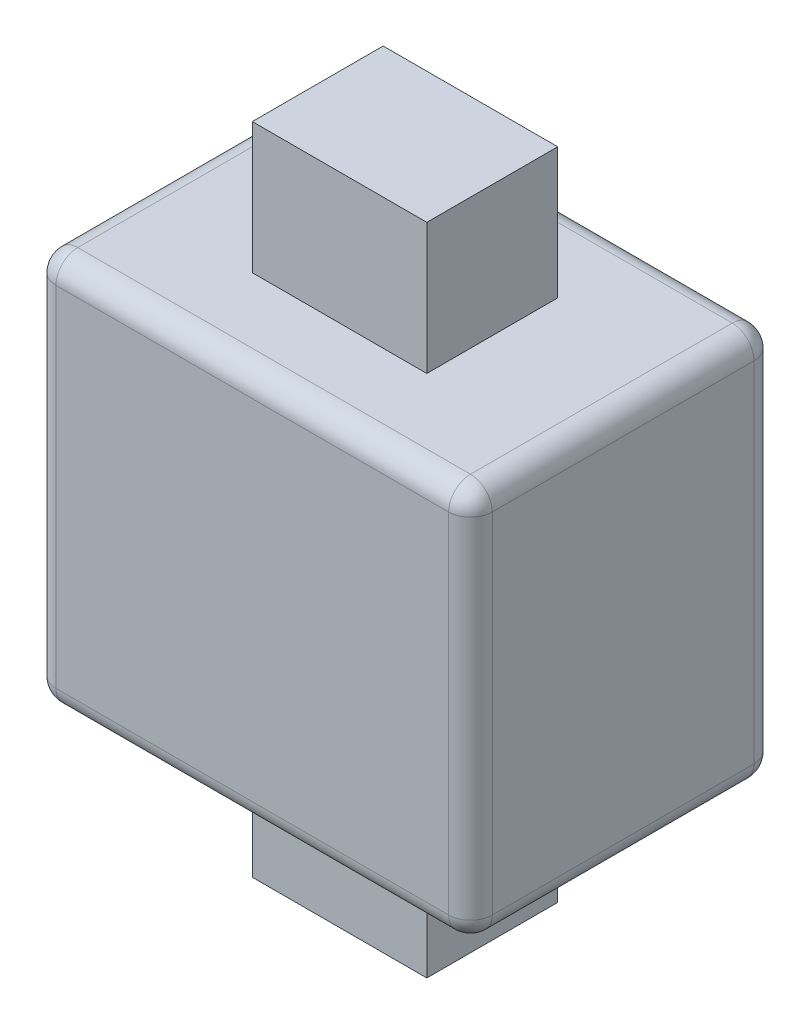
ISO-10303-21;
HEADER;
FILE_DESCRIPTION(('STEP AP214'),'2;1');
FILE_NAME('part.step','',(''),(''),'','','');
FILE_SCHEMA(('AUTOMOTIVE_DESIGN { 1 0 10303 214 1 1 1 1 }'));
ENDSEC;
DATA;
#1=APPLICATION_CONTEXT('core data for automotive mechanical design processes');
#2=APPLICATION_PROTOCOL_DEFINITION('international standard','automotive_design',2000,#1);
#3=PRODUCT_CONTEXT('',#1,'mechanical');
#4=PRODUCT('Part','Part','',(#3));
#5=PRODUCT_RELATED_PRODUCT_CATEGORY('part','',(#4));
#6=PRODUCT_DEFINITION_FORMATION('','',#4);
#7=PRODUCT_DEFINITION_CONTEXT('part definition',#1,'design');
#8=PRODUCT_DEFINITION('design','',#6,#7);
#9=PRODUCT_DEFINITION_SHAPE('','',#8);
#10=(LENGTH_UNIT() NAMED_UNIT(*) SI_UNIT(.MILLI.,.METRE.));
#11=(NAMED_UNIT(*) PLANE_ANGLE_UNIT() SI_UNIT($,.RADIAN.));
#12=(NAMED_UNIT(*) SI_UNIT($,.STERADIAN.) SOLID_ANGLE_UNIT());
#13=UNCERTAINTY_MEASURE_WITH_UNIT(LENGTH_MEASURE(1.E-05),#10,'distance_accuracy_value','');
#14=(GEOMETRIC_REPRESENTATION_CONTEXT(3) GLOBAL_UNCERTAINTY_ASSIGNED_CONTEXT((#13)) GLOBAL_UNIT_ASSIGNED_CONTEXT((#10,
#11,#12)) REPRESENTATION_CONTEXT('',''));
#15=CARTESIAN_POINT('',(0.,0.,0.));
#16=DIRECTION('',(0.,0.,1.));
#17=DIRECTION('',(1.,0.,0.));
#18=AXIS2_PLACEMENT_3D('',#15,#16,#17);
#19=CARTESIAN_POINT('',(2.5,2.25,3.5));
#20=DIRECTION('',(-1.,0.,0.));
#21=DIRECTION('',(0.,0.,1.));
#22=AXIS2_PLACEMENT_3D('',#19,#20,#21);
#23=PLANE('',#22);
#24=DIRECTION('',(0.,1.,0.));
#25=VECTOR('',#24,1.);
#26=CARTESIAN_POINT('',(2.5,-2.25,3.25));
#27=LINE('',#26,#25);
#28=CARTESIAN_POINT('',(2.5,2.,3.25));
#29=VERTEX_POINT('',#28);
#30=CARTESIAN_POINT('',(2.5,-2.,3.25));
#31=VERTEX_POINT('',#30);
#32=EDGE_CURVE('E280',#29,#31,#27,.F.);
#33=ORIENTED_EDGE('',*,*,#32,.T.);
#34=DIRECTION('',(0.,0.,-1.));
#35=VECTOR('',#34,1.);
#36=CARTESIAN_POINT('',(2.5,-2.,3.5));
#37=LINE('',#36,#35);
#38=CARTESIAN_POINT('',(2.5,-2.,0.25));
#39=VERTEX_POINT('',#38);
#40=EDGE_CURVE('E284',#31,#39,#37,.T.);
#41=ORIENTED_EDGE('',*,*,#40,.T.);
#42=DIRECTION('',(0.,1.,0.));
#43=VECTOR('',#42,1.);
#44=CARTESIAN_POINT('',(2.5,2.25,0.25));
#45=LINE('',#44,#43);
#46=CARTESIAN_POINT('',(2.5,2.,0.25));
#47=VERTEX_POINT('',#46);
#48=EDGE_CURVE('E282',#39,#47,#45,.T.);
#49=ORIENTED_EDGE('',*,*,#48,.T.);
#50=DIRECTION('',(0.,0.,-1.));
#51=VECTOR('',#50,1.);
#52=CARTESIAN_POINT('',(2.5,2.,3.5));
#53=LINE('',#52,#51);
#54=EDGE_CURVE('E278',#47,#29,#53,.F.);
#55=ORIENTED_EDGE('',*,*,#54,.T.);
#56=EDGE_LOOP('',(#33,#41,#49,#55));
#57=FACE_BOUND('',#56,.T.);
#58=ADVANCED_FACE('F38',(#57),#23,.F.);
#59=CARTESIAN_POINT('',(-2.5,2.25,3.5));
#60=DIRECTION('',(0.,-1.,0.));
#61=DIRECTION('',(0.,0.,-1.));
#62=AXIS2_PLACEMENT_3D('',#59,#60,#61);
#63=PLANE('',#62);
#64=DIRECTION('',(0.,0.,-1.));
#65=VECTOR('',#64,1.);
#66=CARTESIAN_POINT('',(2.25,2.25,3.5));
#67=LINE('',#66,#65);
#68=CARTESIAN_POINT('',(2.25,2.25,3.25));
#69=VERTEX_POINT('',#68);
#70=CARTESIAN_POINT('',(2.25,2.25,0.25));
#71=VERTEX_POINT('',#70);
#72=EDGE_CURVE('E62',#69,#71,#67,.T.);
#73=ORIENTED_EDGE('',*,*,#72,.T.);
#74=DIRECTION('',(-1.,0.,0.));
#75=VECTOR('',#74,1.);
#76=CARTESIAN_POINT('',(-2.5,2.25,0.25));
#77=LINE('',#76,#75);
#78=CARTESIAN_POINT('',(-2.25,2.25,0.25));
#79=VERTEX_POINT('',#78);
#80=EDGE_CURVE('E11',#71,#79,#77,.T.);
#81=ORIENTED_EDGE('',*,*,#80,.T.);
#82=DIRECTION('',(0.,0.,-1.));
#83=VECTOR('',#82,1.);
#84=CARTESIAN_POINT('',(-2.25,2.25,3.5));
#85=LINE('',#84,#83);
#86=CARTESIAN_POINT('',(-2.25,2.25,3.25));
#87=VERTEX_POINT('',#86);
#88=EDGE_CURVE('E47',#79,#87,#85,.F.);
#89=ORIENTED_EDGE('',*,*,#88,.T.);
#90=DIRECTION('',(-1.,0.,0.));
#91=VECTOR('',#90,1.);
#92=CARTESIAN_POINT('',(2.5,2.25,3.25));
#93=LINE('',#92,#91);
#94=EDGE_CURVE('E296',#87,#69,#93,.F.);
#95=ORIENTED_EDGE('',*,*,#94,.T.);
#96=EDGE_LOOP('',(#73,#81,#89,#95));
#97=FACE_BOUND('',#96,.T.);
#98=DIRECTION('',(-1.,0.,0.));
#99=VECTOR('',#98,1.);
#100=CARTESIAN_POINT('',(0.,2.25,2.5));
#101=LINE('',#100,#99);
#102=CARTESIAN_POINT('',(1.,2.25,2.5));
#103=VERTEX_POINT('',#102);
#104=CARTESIAN_POINT('',(-1.,2.25,2.5));
#105=VERTEX_POINT('',#104);
#106=EDGE_CURVE('E235',#103,#105,#101,.T.);
#107=ORIENTED_EDGE('',*,*,#106,.T.);
#108=DIRECTION('',(0.,0.,-1.));
#109=VECTOR('',#108,1.);
#110=CARTESIAN_POINT('',(-0.999999999999999,2.25,0.));
#111=LINE('',#110,#109);
#112=CARTESIAN_POINT('',(-1.,2.25,1.));
#113=VERTEX_POINT('',#112);
#114=EDGE_CURVE('E189',#105,#113,#111,.T.);
#115=ORIENTED_EDGE('',*,*,#114,.T.);
#116=DIRECTION('',(-1.,0.,0.));
#117=VECTOR('',#116,1.);
#118=CARTESIAN_POINT('',(0.,2.25,1.));
#119=LINE('',#118,#117);
#120=CARTESIAN_POINT('',(1.,2.25,1.));
#121=VERTEX_POINT('',#120);
#122=EDGE_CURVE('E225',#121,#113,#119,.T.);
#123=ORIENTED_EDGE('',*,*,#122,.F.);
#124=DIRECTION('',(0.,0.,-1.));
#125=VECTOR('',#124,1.);
#126=CARTESIAN_POINT('',(1.,2.25,0.));
#127=LINE('',#126,#125);
#128=EDGE_CURVE('E238',#103,#121,#127,.T.);
#129=ORIENTED_EDGE('',*,*,#128,.F.);
#130=EDGE_LOOP('',(#107,#115,#123,#129));
#131=FACE_BOUND('',#130,.T.);
#132=ADVANCED_FACE('F407',(#97,#131),#63,.F.);
#133=CARTESIAN_POINT('',(-2.5,2.25,3.5));
#134=DIRECTION('',(1.,0.,0.));
#135=DIRECTION('',(0.,1.,0.));
#136=AXIS2_PLACEMENT_3D('',#133,#134,#135);
#137=PLANE('',#136);
#138=DIRECTION('',(0.,-1.,0.));
#139=VECTOR('',#138,1.);
#140=CARTESIAN_POINT('',(-2.5,2.25,0.25));
#141=LINE('',#140,#139);
#142=CARTESIAN_POINT('',(-2.5,2.,0.25));
#143=VERTEX_POINT('',#142);
#144=CARTESIAN_POINT('',(-2.5,-2.,0.25));
#145=VERTEX_POINT('',#144);
#146=EDGE_CURVE('E264',#143,#145,#141,.T.);
#147=ORIENTED_EDGE('',*,*,#146,.T.);
#148=DIRECTION('',(0.,0.,-1.));
#149=VECTOR('',#148,1.);
#150=CARTESIAN_POINT('',(-2.5,-2.,3.5));
#151=LINE('',#150,#149);
#152=CARTESIAN_POINT('',(-2.5,-2.,3.25));
#153=VERTEX_POINT('',#152);
#154=EDGE_CURVE('E266',#145,#153,#151,.F.);
#155=ORIENTED_EDGE('',*,*,#154,.T.);
#156=DIRECTION('',(0.,-1.,0.));
#157=VECTOR('',#156,1.);
#158=CARTESIAN_POINT('',(-2.5,2.25,3.25));
#159=LINE('',#158,#157);
#160=CARTESIAN_POINT('',(-2.5,2.,3.25));
#161=VERTEX_POINT('',#160);
#162=EDGE_CURVE('E262',#153,#161,#159,.F.);
#163=ORIENTED_EDGE('',*,*,#162,.T.);
#164=DIRECTION('',(0.,0.,-1.));
#165=VECTOR('',#164,1.);
#166=CARTESIAN_POINT('',(-2.5,2.,3.5));
#167=LINE('',#166,#165);
#168=EDGE_CURVE('E260',#161,#143,#167,.T.);
#169=ORIENTED_EDGE('',*,*,#168,.T.);
#170=EDGE_LOOP('',(#147,#155,#163,#169));
#171=FACE_BOUND('',#170,.T.);
#172=ADVANCED_FACE('F443',(#171),#137,.F.);
#173=CARTESIAN_POINT('',(-2.5,-2.25,3.5));
#174=DIRECTION('',(0.,1.,0.));
#175=DIRECTION('',(0.,0.,1.));
#176=AXIS2_PLACEMENT_3D('',#173,#174,#175);
#177=PLANE('',#176);
#178=DIRECTION('',(1.,0.,0.));
#179=VECTOR('',#178,1.);
#180=CARTESIAN_POINT('',(-2.5,-2.25,3.25));
#181=LINE('',#180,#179);
#182=CARTESIAN_POINT('',(2.25,-2.25,3.25));
#183=VERTEX_POINT('',#182);
#184=CARTESIAN_POINT('',(-2.25,-2.25,3.25));
#185=VERTEX_POINT('',#184);
#186=EDGE_CURVE('E255',#183,#185,#181,.F.);
#187=ORIENTED_EDGE('',*,*,#186,.T.);
#188=DIRECTION('',(0.,0.,-1.));
#189=VECTOR('',#188,1.);
#190=CARTESIAN_POINT('',(-2.25,-2.25,3.5));
#191=LINE('',#190,#189);
#192=CARTESIAN_POINT('',(-2.25,-2.25,0.25));
#193=VERTEX_POINT('',#192);
#194=EDGE_CURVE('E257',#185,#193,#191,.T.);
#195=ORIENTED_EDGE('',*,*,#194,.T.);
#196=DIRECTION('',(1.,0.,0.));
#197=VECTOR('',#196,1.);
#198=CARTESIAN_POINT('',(-2.5,-2.25,0.25));
#199=LINE('',#198,#197);
#200=CARTESIAN_POINT('',(2.25,-2.25,0.25));
#201=VERTEX_POINT('',#200);
#202=EDGE_CURVE('E251',#193,#201,#199,.T.);
#203=ORIENTED_EDGE('',*,*,#202,.T.);
#204=DIRECTION('',(0.,0.,-1.));
#205=VECTOR('',#204,1.);
#206=CARTESIAN_POINT('',(2.25,-2.25,3.5));
#207=LINE('',#206,#205);
#208=EDGE_CURVE('E253',#201,#183,#207,.F.);
#209=ORIENTED_EDGE('',*,*,#208,.T.);
#210=EDGE_LOOP('',(#187,#195,#203,#209));
#211=FACE_BOUND('',#210,.T.);
#212=DIRECTION('',(1.,0.,0.));
#213=VECTOR('',#212,1.);
#214=CARTESIAN_POINT('',(0.,-2.25,2.5));
#215=LINE('',#214,#213);
#216=CARTESIAN_POINT('',(-1.,-2.25,2.5));
#217=VERTEX_POINT('',#216);
#218=CARTESIAN_POINT('',(1.,-2.25,2.5));
#219=VERTEX_POINT('',#218);
#220=EDGE_CURVE('E210',#217,#219,#215,.T.);
#221=ORIENTED_EDGE('',*,*,#220,.T.);
#222=DIRECTION('',(0.,0.,-1.));
#223=VECTOR('',#222,1.);
#224=CARTESIAN_POINT('',(1.,-2.25,0.));
#225=LINE('',#224,#223);
#226=CARTESIAN_POINT('',(1.,-2.25,1.));
#227=VERTEX_POINT('',#226);
#228=EDGE_CURVE('E184',#219,#227,#225,.T.);
#229=ORIENTED_EDGE('',*,*,#228,.T.);
#230=DIRECTION('',(1.,0.,0.));
#231=VECTOR('',#230,1.);
#232=CARTESIAN_POINT('',(0.,-2.25,1.));
#233=LINE('',#232,#231);
#234=CARTESIAN_POINT('',(-1.,-2.25,0.999999999999999));
#235=VERTEX_POINT('',#234);
#236=EDGE_CURVE('E199',#235,#227,#233,.T.);
#237=ORIENTED_EDGE('',*,*,#236,.F.);
#238=DIRECTION('',(0.,0.,-1.));
#239=VECTOR('',#238,1.);
#240=CARTESIAN_POINT('',(-1.,-2.25,0.));
#241=LINE('',#240,#239);
#242=EDGE_CURVE('E212',#217,#235,#241,.T.);
#243=ORIENTED_EDGE('',*,*,#242,.F.);
#244=EDGE_LOOP('',(#221,#229,#237,#243));
#245=FACE_BOUND('',#244,.T.);
#246=ADVANCED_FACE('F660',(#211,#245),#177,.F.);
#247=CARTESIAN_POINT('',(0.,0.,3.5));
#248=DIRECTION('',(0.,0.,1.));
#249=DIRECTION('',(1.,0.,0.));
#250=AXIS2_PLACEMENT_3D('',#247,#248,#249);
#251=PLANE('',#250);
#252=DIRECTION('',(0.,-1.,0.));
#253=VECTOR('',#252,1.);
#254=CARTESIAN_POINT('',(-2.25,-2.25,3.5));
#255=LINE('',#254,#253);
#256=CARTESIAN_POINT('',(-2.25,2.,3.5));
#257=VERTEX_POINT('',#256);
#258=CARTESIAN_POINT('',(-2.25,-2.,3.5));
#259=VERTEX_POINT('',#258);
#260=EDGE_CURVE('E271',#257,#259,#255,.T.);
#261=ORIENTED_EDGE('',*,*,#260,.T.);
#262=DIRECTION('',(1.,0.,0.));
#263=VECTOR('',#262,1.);
#264=CARTESIAN_POINT('',(2.5,-2.,3.5));
#265=LINE('',#264,#263);
#266=CARTESIAN_POINT('',(2.25,-2.,3.5));
#267=VERTEX_POINT('',#266);
#268=EDGE_CURVE('E275',#259,#267,#265,.T.);
#269=ORIENTED_EDGE('',*,*,#268,.T.);
#270=DIRECTION('',(0.,1.,0.));
#271=VECTOR('',#270,1.);
#272=CARTESIAN_POINT('',(2.25,2.25,3.5));
#273=LINE('',#272,#271);
#274=CARTESIAN_POINT('',(2.25,2.,3.5));
#275=VERTEX_POINT('',#274);
#276=EDGE_CURVE('E273',#267,#275,#273,.T.);
#277=ORIENTED_EDGE('',*,*,#276,.T.);
#278=DIRECTION('',(-1.,0.,0.));
#279=VECTOR('',#278,1.);
#280=CARTESIAN_POINT('',(-2.5,2.,3.5));
#281=LINE('',#280,#279);
#282=EDGE_CURVE('E269',#275,#257,#281,.T.);
#283=ORIENTED_EDGE('',*,*,#282,.T.);
#284=EDGE_LOOP('',(#261,#269,#277,#283));
#285=FACE_BOUND('',#284,.T.);
#286=ADVANCED_FACE('F379',(#285),#251,.T.);
#287=CARTESIAN_POINT('',(0.,0.,0.));
#288=DIRECTION('',(0.,0.,1.));
#289=DIRECTION('',(1.,0.,0.));
#290=AXIS2_PLACEMENT_3D('',#287,#288,#289);
#291=PLANE('',#290);
#292=DIRECTION('',(0.,1.,0.));
#293=VECTOR('',#292,1.);
#294=CARTESIAN_POINT('',(2.25,0.,0.));
#295=LINE('',#294,#293);
#296=CARTESIAN_POINT('',(2.25,2.,0.));
#297=VERTEX_POINT('',#296);
#298=CARTESIAN_POINT('',(2.25,-2.,0.));
#299=VERTEX_POINT('',#298);
#300=EDGE_CURVE('E291',#297,#299,#295,.F.);
#301=ORIENTED_EDGE('',*,*,#300,.T.);
#302=DIRECTION('',(1.,0.,0.));
#303=VECTOR('',#302,1.);
#304=CARTESIAN_POINT('',(0.,-2.,0.));
#305=LINE('',#304,#303);
#306=CARTESIAN_POINT('',(-2.25,-2.,0.));
#307=VERTEX_POINT('',#306);
#308=EDGE_CURVE('E293',#299,#307,#305,.F.);
#309=ORIENTED_EDGE('',*,*,#308,.T.);
#310=DIRECTION('',(0.,-1.,0.));
#311=VECTOR('',#310,1.);
#312=CARTESIAN_POINT('',(-2.25,0.,0.));
#313=LINE('',#312,#311);
#314=CARTESIAN_POINT('',(-2.25,2.,0.));
#315=VERTEX_POINT('',#314);
#316=EDGE_CURVE('E289',#307,#315,#313,.F.);
#317=ORIENTED_EDGE('',*,*,#316,.T.);
#318=DIRECTION('',(-1.,0.,0.));
#319=VECTOR('',#318,1.);
#320=CARTESIAN_POINT('',(0.,2.,0.));
#321=LINE('',#320,#319);
#322=EDGE_CURVE('E287',#315,#297,#321,.F.);
#323=ORIENTED_EDGE('',*,*,#322,.T.);
#324=EDGE_LOOP('',(#301,#309,#317,#323));
#325=FACE_BOUND('',#324,.T.);
#326=ADVANCED_FACE('F677',(#325),#291,.F.);
#327=CARTESIAN_POINT('',(-0.999999999999999,3.75,0.));
#328=DIRECTION('',(-1.,0.,0.));
#329=DIRECTION('',(0.,0.,1.));
#330=AXIS2_PLACEMENT_3D('',#327,#328,#329);
#331=PLANE('',#330);
#332=ORIENTED_EDGE('',*,*,#114,.F.);
#333=DIRECTION('',(0.,-1.,0.));
#334=VECTOR('',#333,1.);
#335=CARTESIAN_POINT('',(-1.,3.75,2.5));
#336=LINE('',#335,#334);
#337=CARTESIAN_POINT('',(-1.,3.75,2.5));
#338=VERTEX_POINT('',#337);
#339=EDGE_CURVE('E248',#338,#105,#336,.T.);
#340=ORIENTED_EDGE('',*,*,#339,.F.);
#341=DIRECTION('',(0.,0.,-1.));
#342=VECTOR('',#341,1.);
#343=CARTESIAN_POINT('',(-0.999999999999999,3.75,0.));
#344=LINE('',#343,#342);
#345=CARTESIAN_POINT('',(-1.,3.75,1.));
#346=VERTEX_POINT('',#345);
#347=EDGE_CURVE('E221',#338,#346,#344,.T.);
#348=ORIENTED_EDGE('',*,*,#347,.T.);
#349=DIRECTION('',(0.,-1.,0.));
#350=VECTOR('',#349,1.);
#351=CARTESIAN_POINT('',(-1.,3.75,1.));
#352=LINE('',#351,#350);
#353=EDGE_CURVE('E232',#346,#113,#352,.T.);
#354=ORIENTED_EDGE('',*,*,#353,.T.);
#355=EDGE_LOOP('',(#332,#340,#348,#354));
#356=FACE_BOUND('',#355,.T.);
#357=ADVANCED_FACE('F685',(#356),#331,.T.);
#358=CARTESIAN_POINT('',(0.,3.75,2.5));
#359=DIRECTION('',(0.,0.,1.));
#360=DIRECTION('',(1.,0.,0.));
#361=AXIS2_PLACEMENT_3D('',#358,#359,#360);
#362=PLANE('',#361);
#363=ORIENTED_EDGE('',*,*,#106,.F.);
#364=DIRECTION('',(0.,-1.,0.));
#365=VECTOR('',#364,1.);
#366=CARTESIAN_POINT('',(1.,3.75,2.5));
#367=LINE('',#366,#365);
#368=CARTESIAN_POINT('',(1.,3.75,2.5));
#369=VERTEX_POINT('',#368);
#370=EDGE_CURVE('E246',#369,#103,#367,.T.);
#371=ORIENTED_EDGE('',*,*,#370,.F.);
#372=DIRECTION('',(-1.,0.,0.));
#373=VECTOR('',#372,1.);
#374=CARTESIAN_POINT('',(0.,3.75,2.5));
#375=LINE('',#374,#373);
#376=EDGE_CURVE('E224',#369,#338,#375,.T.);
#377=ORIENTED_EDGE('',*,*,#376,.T.);
#378=ORIENTED_EDGE('',*,*,#339,.T.);
#379=EDGE_LOOP('',(#363,#371,#377,#378));
#380=FACE_BOUND('',#379,.T.);
#381=ADVANCED_FACE('F698',(#380),#362,.T.);
#382=CARTESIAN_POINT('',(1.,3.75,0.));
#383=DIRECTION('',(-1.,0.,0.));
#384=DIRECTION('',(0.,0.,1.));
#385=AXIS2_PLACEMENT_3D('',#382,#383,#384);
#386=PLANE('',#385);
#387=ORIENTED_EDGE('',*,*,#128,.T.);
#388=DIRECTION('',(0.,-1.,0.));
#389=VECTOR('',#388,1.);
#390=CARTESIAN_POINT('',(1.,3.75,1.));
#391=LINE('',#390,#389);
#392=CARTESIAN_POINT('',(1.,3.75,1.));
#393=VERTEX_POINT('',#392);
#394=EDGE_CURVE('E243',#393,#121,#391,.T.);
#395=ORIENTED_EDGE('',*,*,#394,.F.);
#396=DIRECTION('',(0.,0.,-1.));
#397=VECTOR('',#396,1.);
#398=CARTESIAN_POINT('',(1.,3.75,0.));
#399=LINE('',#398,#397);
#400=EDGE_CURVE('E228',#369,#393,#399,.T.);
#401=ORIENTED_EDGE('',*,*,#400,.F.);
#402=ORIENTED_EDGE('',*,*,#370,.T.);
#403=EDGE_LOOP('',(#387,#395,#401,#402));
#404=FACE_BOUND('',#403,.T.);
#405=ADVANCED_FACE('F707',(#404),#386,.F.);
#406=CARTESIAN_POINT('',(0.,3.75,1.));
#407=DIRECTION('',(0.,0.,1.));
#408=DIRECTION('',(1.,0.,0.));
#409=AXIS2_PLACEMENT_3D('',#406,#407,#408);
#410=PLANE('',#409);
#411=ORIENTED_EDGE('',*,*,#122,.T.);
#412=ORIENTED_EDGE('',*,*,#353,.F.);
#413=DIRECTION('',(-1.,0.,0.));
#414=VECTOR('',#413,1.);
#415=CARTESIAN_POINT('',(0.,3.75,1.));
#416=LINE('',#415,#414);
#417=EDGE_CURVE('E230',#393,#346,#416,.T.);
#418=ORIENTED_EDGE('',*,*,#417,.F.);
#419=ORIENTED_EDGE('',*,*,#394,.T.);
#420=EDGE_LOOP('',(#411,#412,#418,#419));
#421=FACE_BOUND('',#420,.T.);
#422=ADVANCED_FACE('F714',(#421),#410,.F.);
#423=CARTESIAN_POINT('',(0.,3.75,0.));
#424=DIRECTION('',(0.,1.,0.));
#425=DIRECTION('',(0.,0.,1.));
#426=AXIS2_PLACEMENT_3D('',#423,#424,#425);
#427=PLANE('',#426);
#428=ORIENTED_EDGE('',*,*,#347,.F.);
#429=ORIENTED_EDGE('',*,*,#376,.F.);
#430=ORIENTED_EDGE('',*,*,#400,.T.);
#431=ORIENTED_EDGE('',*,*,#417,.T.);
#432=EDGE_LOOP('',(#428,#429,#430,#431));
#433=FACE_BOUND('',#432,.T.);
#434=ADVANCED_FACE('F722',(#433),#427,.T.);
#435=CARTESIAN_POINT('',(1.,-3.75,0.));
#436=DIRECTION('',(1.,0.,0.));
#437=DIRECTION('',(0.,0.,-1.));
#438=AXIS2_PLACEMENT_3D('',#435,#436,#437);
#439=PLANE('',#438);
#440=ORIENTED_EDGE('',*,*,#228,.F.);
#441=DIRECTION('',(0.,1.,0.));
#442=VECTOR('',#441,1.);
#443=CARTESIAN_POINT('',(1.,-3.75,2.5));
#444=LINE('',#443,#442);
#445=CARTESIAN_POINT('',(1.,-3.75,2.5));
#446=VERTEX_POINT('',#445);
#447=EDGE_CURVE('E179',#446,#219,#444,.T.);
#448=ORIENTED_EDGE('',*,*,#447,.F.);
#449=DIRECTION('',(0.,0.,-1.));
#450=VECTOR('',#449,1.);
#451=CARTESIAN_POINT('',(1.,-3.75,0.));
#452=LINE('',#451,#450);
#453=CARTESIAN_POINT('',(1.,-3.75,1.));
#454=VERTEX_POINT('',#453);
#455=EDGE_CURVE('E182',#446,#454,#452,.T.);
#456=ORIENTED_EDGE('',*,*,#455,.T.);
#457=DIRECTION('',(0.,1.,0.));
#458=VECTOR('',#457,1.);
#459=CARTESIAN_POINT('',(1.,-3.75,1.));
#460=LINE('',#459,#458);
#461=EDGE_CURVE('E208',#454,#227,#460,.T.);
#462=ORIENTED_EDGE('',*,*,#461,.T.);
#463=EDGE_LOOP('',(#440,#448,#456,#462));
#464=FACE_BOUND('',#463,.T.);
#465=ADVANCED_FACE('F181',(#464),#439,.T.);
#466=CARTESIAN_POINT('',(0.,-3.75,2.5));
#467=DIRECTION('',(0.,0.,1.));
#468=DIRECTION('',(1.,0.,0.));
#469=AXIS2_PLACEMENT_3D('',#466,#467,#468);
#470=PLANE('',#469);
#471=ORIENTED_EDGE('',*,*,#220,.F.);
#472=DIRECTION('',(0.,1.,0.));
#473=VECTOR('',#472,1.);
#474=CARTESIAN_POINT('',(-1.,-3.75,2.5));
#475=LINE('',#474,#473);
#476=CARTESIAN_POINT('',(-1.,-3.75,2.5));
#477=VERTEX_POINT('',#476);
#478=EDGE_CURVE('E190',#477,#217,#475,.T.);
#479=ORIENTED_EDGE('',*,*,#478,.F.);
#480=DIRECTION('',(1.,0.,0.));
#481=VECTOR('',#480,1.);
#482=CARTESIAN_POINT('',(0.,-3.75,2.5));
#483=LINE('',#482,#481);
#484=EDGE_CURVE('E195',#477,#446,#483,.T.);
#485=ORIENTED_EDGE('',*,*,#484,.T.);
#486=ORIENTED_EDGE('',*,*,#447,.T.);
#487=EDGE_LOOP('',(#471,#479,#485,#486));
#488=FACE_BOUND('',#487,.T.);
#489=ADVANCED_FACE('F201',(#488),#470,.T.);
#490=CARTESIAN_POINT('',(-1.,-3.75,0.));
#491=DIRECTION('',(1.,0.,0.));
#492=DIRECTION('',(0.,0.,-1.));
#493=AXIS2_PLACEMENT_3D('',#490,#491,#492);
#494=PLANE('',#493);
#495=ORIENTED_EDGE('',*,*,#242,.T.);
#496=DIRECTION('',(0.,1.,0.));
#497=VECTOR('',#496,1.);
#498=CARTESIAN_POINT('',(-1.,-3.75,0.999999999999999));
#499=LINE('',#498,#497);
#500=CARTESIAN_POINT('',(-1.,-3.75,0.999999999999999));
#501=VERTEX_POINT('',#500);
#502=EDGE_CURVE('E217',#501,#235,#499,.T.);
#503=ORIENTED_EDGE('',*,*,#502,.F.);
#504=DIRECTION('',(0.,0.,-1.));
#505=VECTOR('',#504,1.);
#506=CARTESIAN_POINT('',(-1.,-3.75,0.));
#507=LINE('',#506,#505);
#508=EDGE_CURVE('E203',#477,#501,#507,.T.);
#509=ORIENTED_EDGE('',*,*,#508,.F.);
#510=ORIENTED_EDGE('',*,*,#478,.T.);
#511=EDGE_LOOP('',(#495,#503,#509,#510));
#512=FACE_BOUND('',#511,.T.);
#513=ADVANCED_FACE('F741',(#512),#494,.F.);
#514=CARTESIAN_POINT('',(0.,-3.75,1.));
#515=DIRECTION('',(0.,0.,1.));
#516=DIRECTION('',(1.,0.,0.));
#517=AXIS2_PLACEMENT_3D('',#514,#515,#516);
#518=PLANE('',#517);
#519=ORIENTED_EDGE('',*,*,#236,.T.);
#520=ORIENTED_EDGE('',*,*,#461,.F.);
#521=DIRECTION('',(1.,0.,0.));
#522=VECTOR('',#521,1.);
#523=CARTESIAN_POINT('',(0.,-3.75,1.));
#524=LINE('',#523,#522);
#525=EDGE_CURVE('E197',#501,#454,#524,.T.);
#526=ORIENTED_EDGE('',*,*,#525,.F.);
#527=ORIENTED_EDGE('',*,*,#502,.T.);
#528=EDGE_LOOP('',(#519,#520,#526,#527));
#529=FACE_BOUND('',#528,.T.);
#530=ADVANCED_FACE('F630',(#529),#518,.F.);
#531=CARTESIAN_POINT('',(0.,-3.75,0.));
#532=DIRECTION('',(0.,-1.,0.));
#533=DIRECTION('',(0.,0.,-1.));
#534=AXIS2_PLACEMENT_3D('',#531,#532,#533);
#535=PLANE('',#534);
#536=ORIENTED_EDGE('',*,*,#455,.F.);
#537=ORIENTED_EDGE('',*,*,#484,.F.);
#538=ORIENTED_EDGE('',*,*,#508,.T.);
#539=ORIENTED_EDGE('',*,*,#525,.T.);
#540=EDGE_LOOP('',(#536,#537,#538,#539));
#541=FACE_BOUND('',#540,.T.);
#542=ADVANCED_FACE('F194',(#541),#535,.T.);
#543=CARTESIAN_POINT('',(2.25,2.,3.5));
#544=DIRECTION('',(0.,0.,-1.));
#545=DIRECTION('',(-1.,0.,0.));
#546=AXIS2_PLACEMENT_3D('',#543,#544,#545);
#547=CYLINDRICAL_SURFACE('',#546,0.25);
#548=CARTESIAN_POINT('',(2.25,2.,3.25));
#549=DIRECTION('',(0.,0.,1.));
#550=DIRECTION('',(1.,0.,0.));
#551=AXIS2_PLACEMENT_3D('',#548,#549,#550);
#552=CIRCLE('',#551,0.25);
#553=EDGE_CURVE('E42',#29,#69,#552,.T.);
#554=ORIENTED_EDGE('',*,*,#553,.F.);
#555=ORIENTED_EDGE('',*,*,#54,.F.);
#556=CARTESIAN_POINT('',(2.25,2.,0.25));
#557=DIRECTION('',(0.,0.,-1.));
#558=DIRECTION('',(-1.,0.,0.));
#559=AXIS2_PLACEMENT_3D('',#556,#557,#558);
#560=CIRCLE('',#559,0.25);
#561=EDGE_CURVE('E357',#71,#47,#560,.T.);
#562=ORIENTED_EDGE('',*,*,#561,.F.);
#563=ORIENTED_EDGE('',*,*,#72,.F.);
#564=EDGE_LOOP('',(#554,#555,#562,#563));
#565=FACE_BOUND('',#564,.T.);
#566=ADVANCED_FACE('F40',(#565),#547,.T.);
#567=CARTESIAN_POINT('',(2.25,2.,3.25));
#568=DIRECTION('',(0.,0.,1.));
#569=DIRECTION('',(1.,0.,0.));
#570=AXIS2_PLACEMENT_3D('',#567,#568,#569);
#571=SPHERICAL_SURFACE('',#570,0.25);
#572=CARTESIAN_POINT('',(2.25,2.,3.25));
#573=DIRECTION('',(0.,1.,0.));
#574=DIRECTION('',(0.,0.,1.));
#575=AXIS2_PLACEMENT_3D('',#572,#573,#574);
#576=CIRCLE('',#575,0.25);
#577=EDGE_CURVE('E352',#29,#275,#576,.F.);
#578=ORIENTED_EDGE('',*,*,#577,.F.);
#579=ORIENTED_EDGE('',*,*,#553,.T.);
#580=CARTESIAN_POINT('',(2.25,2.,3.25));
#581=DIRECTION('',(1.,0.,0.));
#582=DIRECTION('',(0.,0.,-1.));
#583=AXIS2_PLACEMENT_3D('',#580,#581,#582);
#584=CIRCLE('',#583,0.25);
#585=EDGE_CURVE('E355',#275,#69,#584,.F.);
#586=ORIENTED_EDGE('',*,*,#585,.F.);
#587=EDGE_LOOP('',(#578,#579,#586));
#588=FACE_BOUND('',#587,.T.);
#589=ADVANCED_FACE('F367',(#588),#571,.T.);
#590=CARTESIAN_POINT('',(2.25,2.,0.25));
#591=DIRECTION('',(0.,0.,1.));
#592=DIRECTION('',(1.,0.,0.));
#593=AXIS2_PLACEMENT_3D('',#590,#591,#592);
#594=SPHERICAL_SURFACE('',#593,0.25);
#595=CARTESIAN_POINT('',(2.25,2.,0.25));
#596=DIRECTION('',(1.,0.,0.));
#597=DIRECTION('',(0.,1.,0.));
#598=AXIS2_PLACEMENT_3D('',#595,#596,#597);
#599=CIRCLE('',#598,0.25);
#600=EDGE_CURVE('E346',#71,#297,#599,.F.);
#601=ORIENTED_EDGE('',*,*,#600,.F.);
#602=ORIENTED_EDGE('',*,*,#561,.T.);
#603=CARTESIAN_POINT('',(2.25,2.,0.25));
#604=DIRECTION('',(0.,1.,0.));
#605=DIRECTION('',(0.,0.,1.));
#606=AXIS2_PLACEMENT_3D('',#603,#604,#605);
#607=CIRCLE('',#606,0.25);
#608=EDGE_CURVE('E349',#297,#47,#607,.F.);
#609=ORIENTED_EDGE('',*,*,#608,.F.);
#610=EDGE_LOOP('',(#601,#602,#609));
#611=FACE_BOUND('',#610,.T.);
#612=ADVANCED_FACE('F402',(#611),#594,.T.);
#613=CARTESIAN_POINT('',(0.,2.,3.25));
#614=DIRECTION('',(1.,0.,0.));
#615=DIRECTION('',(0.,0.,-1.));
#616=AXIS2_PLACEMENT_3D('',#613,#614,#615);
#617=CYLINDRICAL_SURFACE('',#616,0.25);
#618=ORIENTED_EDGE('',*,*,#585,.T.);
#619=ORIENTED_EDGE('',*,*,#94,.F.);
#620=CARTESIAN_POINT('',(-2.25,2.,3.25));
#621=DIRECTION('',(-1.,0.,0.));
#622=DIRECTION('',(0.,-1.,0.));
#623=AXIS2_PLACEMENT_3D('',#620,#621,#622);
#624=CIRCLE('',#623,0.25);
#625=EDGE_CURVE('E340',#257,#87,#624,.T.);
#626=ORIENTED_EDGE('',*,*,#625,.F.);
#627=ORIENTED_EDGE('',*,*,#282,.F.);
#628=EDGE_LOOP('',(#618,#619,#626,#627));
#629=FACE_BOUND('',#628,.T.);
#630=ADVANCED_FACE('F374',(#629),#617,.T.);
#631=CARTESIAN_POINT('',(2.25,0.,3.25));
#632=DIRECTION('',(0.,-1.,0.));
#633=DIRECTION('',(0.,0.,-1.));
#634=AXIS2_PLACEMENT_3D('',#631,#632,#633);
#635=CYLINDRICAL_SURFACE('',#634,0.25);
#636=ORIENTED_EDGE('',*,*,#577,.T.);
#637=ORIENTED_EDGE('',*,*,#276,.F.);
#638=CARTESIAN_POINT('',(2.25,-2.,3.25));
#639=DIRECTION('',(0.,-1.,0.));
#640=DIRECTION('',(0.,0.,-1.));
#641=AXIS2_PLACEMENT_3D('',#638,#639,#640);
#642=CIRCLE('',#641,0.25);
#643=EDGE_CURVE('E337',#31,#267,#642,.T.);
#644=ORIENTED_EDGE('',*,*,#643,.F.);
#645=ORIENTED_EDGE('',*,*,#32,.F.);
#646=EDGE_LOOP('',(#636,#637,#644,#645));
#647=FACE_BOUND('',#646,.T.);
#648=ADVANCED_FACE('F385',(#647),#635,.T.);
#649=CARTESIAN_POINT('',(2.25,-2.,3.5));
#650=DIRECTION('',(0.,0.,-1.));
#651=DIRECTION('',(-1.,0.,0.));
#652=AXIS2_PLACEMENT_3D('',#649,#650,#651);
#653=CYLINDRICAL_SURFACE('',#652,0.25);
#654=CARTESIAN_POINT('',(2.25,-2.,0.25));
#655=DIRECTION('',(0.,0.,-1.));
#656=DIRECTION('',(-1.,0.,0.));
#657=AXIS2_PLACEMENT_3D('',#654,#655,#656);
#658=CIRCLE('',#657,0.25);
#659=EDGE_CURVE('E331',#39,#201,#658,.T.);
#660=ORIENTED_EDGE('',*,*,#659,.F.);
#661=ORIENTED_EDGE('',*,*,#40,.F.);
#662=CARTESIAN_POINT('',(2.25,-2.,3.25));
#663=DIRECTION('',(0.,0.,1.));
#664=DIRECTION('',(1.,0.,0.));
#665=AXIS2_PLACEMENT_3D('',#662,#663,#664);
#666=CIRCLE('',#665,0.25);
#667=EDGE_CURVE('E334',#183,#31,#666,.T.);
#668=ORIENTED_EDGE('',*,*,#667,.F.);
#669=ORIENTED_EDGE('',*,*,#208,.F.);
#670=EDGE_LOOP('',(#660,#661,#668,#669));
#671=FACE_BOUND('',#670,.T.);
#672=ADVANCED_FACE('F391',(#671),#653,.T.);
#673=CARTESIAN_POINT('',(2.25,2.25,0.25));
#674=DIRECTION('',(0.,1.,0.));
#675=DIRECTION('',(0.,0.,1.));
#676=AXIS2_PLACEMENT_3D('',#673,#674,#675);
#677=CYLINDRICAL_SURFACE('',#676,0.25);
#678=ORIENTED_EDGE('',*,*,#608,.T.);
#679=ORIENTED_EDGE('',*,*,#48,.F.);
#680=CARTESIAN_POINT('',(2.25,-2.,0.25));
#681=DIRECTION('',(0.,-1.,0.));
#682=DIRECTION('',(1.,0.,0.));
#683=AXIS2_PLACEMENT_3D('',#680,#681,#682);
#684=CIRCLE('',#683,0.25);
#685=EDGE_CURVE('E329',#299,#39,#684,.T.);
#686=ORIENTED_EDGE('',*,*,#685,.F.);
#687=ORIENTED_EDGE('',*,*,#300,.F.);
#688=EDGE_LOOP('',(#678,#679,#686,#687));
#689=FACE_BOUND('',#688,.T.);
#690=ADVANCED_FACE('F399',(#689),#677,.T.);
#691=CARTESIAN_POINT('',(-2.5,2.,0.25));
#692=DIRECTION('',(-1.,0.,0.));
#693=DIRECTION('',(0.,0.,1.));
#694=AXIS2_PLACEMENT_3D('',#691,#692,#693);
#695=CYLINDRICAL_SURFACE('',#694,0.25);
#696=ORIENTED_EDGE('',*,*,#600,.T.);
#697=ORIENTED_EDGE('',*,*,#322,.F.);
#698=CARTESIAN_POINT('',(-2.25,2.,0.25));
#699=DIRECTION('',(-1.,0.,0.));
#700=DIRECTION('',(0.,0.,1.));
#701=AXIS2_PLACEMENT_3D('',#698,#699,#700);
#702=CIRCLE('',#701,0.25);
#703=EDGE_CURVE('E327',#79,#315,#702,.T.);
#704=ORIENTED_EDGE('',*,*,#703,.F.);
#705=ORIENTED_EDGE('',*,*,#80,.F.);
#706=EDGE_LOOP('',(#696,#697,#704,#705));
#707=FACE_BOUND('',#706,.T.);
#708=ADVANCED_FACE('F405',(#707),#695,.T.);
#709=CARTESIAN_POINT('',(-2.25,2.,3.5));
#710=DIRECTION('',(0.,0.,-1.));
#711=DIRECTION('',(-1.,0.,0.));
#712=AXIS2_PLACEMENT_3D('',#709,#710,#711);
#713=CYLINDRICAL_SURFACE('',#712,0.25);
#714=CARTESIAN_POINT('',(-2.25,2.,3.25));
#715=DIRECTION('',(0.,0.,1.));
#716=DIRECTION('',(1.,0.,0.));
#717=AXIS2_PLACEMENT_3D('',#714,#715,#716);
#718=CIRCLE('',#717,0.25);
#719=EDGE_CURVE('E343',#87,#161,#718,.T.);
#720=ORIENTED_EDGE('',*,*,#719,.F.);
#721=ORIENTED_EDGE('',*,*,#88,.F.);
#722=CARTESIAN_POINT('',(-2.25,2.,0.25));
#723=DIRECTION('',(0.,0.,-1.));
#724=DIRECTION('',(-1.,0.,0.));
#725=AXIS2_PLACEMENT_3D('',#722,#723,#724);
#726=CIRCLE('',#725,0.25);
#727=EDGE_CURVE('E55',#143,#79,#726,.T.);
#728=ORIENTED_EDGE('',*,*,#727,.F.);
#729=ORIENTED_EDGE('',*,*,#168,.F.);
#730=EDGE_LOOP('',(#720,#721,#728,#729));
#731=FACE_BOUND('',#730,.T.);
#732=ADVANCED_FACE('F410',(#731),#713,.T.);
#733=CARTESIAN_POINT('',(-2.25,2.,3.25));
#734=DIRECTION('',(0.,0.,1.));
#735=DIRECTION('',(1.,0.,0.));
#736=AXIS2_PLACEMENT_3D('',#733,#734,#735);
#737=SPHERICAL_SURFACE('',#736,0.25);
#738=ORIENTED_EDGE('',*,*,#625,.T.);
#739=ORIENTED_EDGE('',*,*,#719,.T.);
#740=CARTESIAN_POINT('',(-2.25,2.,3.25));
#741=DIRECTION('',(0.,1.,0.));
#742=DIRECTION('',(0.,0.,1.));
#743=AXIS2_PLACEMENT_3D('',#740,#741,#742);
#744=CIRCLE('',#743,0.25);
#745=EDGE_CURVE('E323',#257,#161,#744,.F.);
#746=ORIENTED_EDGE('',*,*,#745,.F.);
#747=EDGE_LOOP('',(#738,#739,#746));
#748=FACE_BOUND('',#747,.T.);
#749=ADVANCED_FACE('F413',(#748),#737,.T.);
#750=CARTESIAN_POINT('',(2.25,-2.,3.25));
#751=DIRECTION('',(0.,0.,1.));
#752=DIRECTION('',(1.,0.,0.));
#753=AXIS2_PLACEMENT_3D('',#750,#751,#752);
#754=SPHERICAL_SURFACE('',#753,0.25);
#755=ORIENTED_EDGE('',*,*,#667,.T.);
#756=ORIENTED_EDGE('',*,*,#643,.T.);
#757=CARTESIAN_POINT('',(2.25,-2.,3.25));
#758=DIRECTION('',(1.,0.,0.));
#759=DIRECTION('',(0.,0.,-1.));
#760=AXIS2_PLACEMENT_3D('',#757,#758,#759);
#761=CIRCLE('',#760,0.25);
#762=EDGE_CURVE('E321',#183,#267,#761,.F.);
#763=ORIENTED_EDGE('',*,*,#762,.F.);
#764=EDGE_LOOP('',(#755,#756,#763));
#765=FACE_BOUND('',#764,.T.);
#766=ADVANCED_FACE('F427',(#765),#754,.T.);
#767=CARTESIAN_POINT('',(2.25,-2.,0.25));
#768=DIRECTION('',(0.,0.,1.));
#769=DIRECTION('',(1.,0.,0.));
#770=AXIS2_PLACEMENT_3D('',#767,#768,#769);
#771=SPHERICAL_SURFACE('',#770,0.25);
#772=ORIENTED_EDGE('',*,*,#685,.T.);
#773=ORIENTED_EDGE('',*,*,#659,.T.);
#774=CARTESIAN_POINT('',(2.25,-2.,0.25));
#775=DIRECTION('',(1.,0.,0.));
#776=DIRECTION('',(0.,0.,-1.));
#777=AXIS2_PLACEMENT_3D('',#774,#775,#776);
#778=CIRCLE('',#777,0.25);
#779=EDGE_CURVE('E318',#299,#201,#778,.F.);
#780=ORIENTED_EDGE('',*,*,#779,.F.);
#781=EDGE_LOOP('',(#772,#773,#780));
#782=FACE_BOUND('',#781,.T.);
#783=ADVANCED_FACE('F429',(#782),#771,.T.);
#784=CARTESIAN_POINT('',(-2.25,2.,0.25));
#785=DIRECTION('',(0.,0.,1.));
#786=DIRECTION('',(1.,0.,0.));
#787=AXIS2_PLACEMENT_3D('',#784,#785,#786);
#788=SPHERICAL_SURFACE('',#787,0.25);
#789=ORIENTED_EDGE('',*,*,#727,.T.);
#790=ORIENTED_EDGE('',*,*,#703,.T.);
#791=CARTESIAN_POINT('',(-2.25,2.,0.25));
#792=DIRECTION('',(0.,1.,0.));
#793=DIRECTION('',(0.,0.,1.));
#794=AXIS2_PLACEMENT_3D('',#791,#792,#793);
#795=CIRCLE('',#794,0.25);
#796=EDGE_CURVE('E315',#143,#315,#795,.F.);
#797=ORIENTED_EDGE('',*,*,#796,.F.);
#798=EDGE_LOOP('',(#789,#790,#797));
#799=FACE_BOUND('',#798,.T.);
#800=ADVANCED_FACE('F435',(#799),#788,.T.);
#801=CARTESIAN_POINT('',(-2.25,0.,3.25));
#802=DIRECTION('',(0.,1.,0.));
#803=DIRECTION('',(-1.,0.,0.));
#804=AXIS2_PLACEMENT_3D('',#801,#802,#803);
#805=CYLINDRICAL_SURFACE('',#804,0.25);
#806=ORIENTED_EDGE('',*,*,#745,.T.);
#807=ORIENTED_EDGE('',*,*,#162,.F.);
#808=CARTESIAN_POINT('',(-2.25,-2.,3.25));
#809=DIRECTION('',(0.,-1.,0.));
#810=DIRECTION('',(0.,0.,-1.));
#811=AXIS2_PLACEMENT_3D('',#808,#809,#810);
#812=CIRCLE('',#811,0.25);
#813=EDGE_CURVE('E312',#259,#153,#812,.T.);
#814=ORIENTED_EDGE('',*,*,#813,.F.);
#815=ORIENTED_EDGE('',*,*,#260,.F.);
#816=EDGE_LOOP('',(#806,#807,#814,#815));
#817=FACE_BOUND('',#816,.T.);
#818=ADVANCED_FACE('F417',(#817),#805,.T.);
#819=CARTESIAN_POINT('',(0.,-2.,3.25));
#820=DIRECTION('',(-1.,0.,0.));
#821=DIRECTION('',(0.,0.,1.));
#822=AXIS2_PLACEMENT_3D('',#819,#820,#821);
#823=CYLINDRICAL_SURFACE('',#822,0.25);
#824=ORIENTED_EDGE('',*,*,#762,.T.);
#825=ORIENTED_EDGE('',*,*,#268,.F.);
#826=CARTESIAN_POINT('',(-2.25,-2.,3.25));
#827=DIRECTION('',(-1.,0.,0.));
#828=DIRECTION('',(0.,0.,1.));
#829=AXIS2_PLACEMENT_3D('',#826,#827,#828);
#830=CIRCLE('',#829,0.25);
#831=EDGE_CURVE('E309',#185,#259,#830,.T.);
#832=ORIENTED_EDGE('',*,*,#831,.F.);
#833=ORIENTED_EDGE('',*,*,#186,.F.);
#834=EDGE_LOOP('',(#824,#825,#832,#833));
#835=FACE_BOUND('',#834,.T.);
#836=ADVANCED_FACE('F425',(#835),#823,.T.);
#837=CARTESIAN_POINT('',(-2.5,-2.,0.25));
#838=DIRECTION('',(1.,0.,0.));
#839=DIRECTION('',(0.,0.,-1.));
#840=AXIS2_PLACEMENT_3D('',#837,#838,#839);
#841=CYLINDRICAL_SURFACE('',#840,0.25);
#842=ORIENTED_EDGE('',*,*,#779,.T.);
#843=ORIENTED_EDGE('',*,*,#202,.F.);
#844=CARTESIAN_POINT('',(-2.25,-2.,0.25));
#845=DIRECTION('',(-1.,0.,0.));
#846=DIRECTION('',(0.,0.,1.));
#847=AXIS2_PLACEMENT_3D('',#844,#845,#846);
#848=CIRCLE('',#847,0.25);
#849=EDGE_CURVE('E306',#307,#193,#848,.T.);
#850=ORIENTED_EDGE('',*,*,#849,.F.);
#851=ORIENTED_EDGE('',*,*,#308,.F.);
#852=EDGE_LOOP('',(#842,#843,#850,#851));
#853=FACE_BOUND('',#852,.T.);
#854=ADVANCED_FACE('F460',(#853),#841,.T.);
#855=CARTESIAN_POINT('',(-2.25,2.25,0.25));
#856=DIRECTION('',(0.,-1.,0.));
#857=DIRECTION('',(1.,0.,0.));
#858=AXIS2_PLACEMENT_3D('',#855,#856,#857);
#859=CYLINDRICAL_SURFACE('',#858,0.25);
#860=ORIENTED_EDGE('',*,*,#796,.T.);
#861=ORIENTED_EDGE('',*,*,#316,.F.);
#862=CARTESIAN_POINT('',(-2.25,-2.,0.25));
#863=DIRECTION('',(0.,-1.,0.));
#864=DIRECTION('',(0.,0.,-1.));
#865=AXIS2_PLACEMENT_3D('',#862,#863,#864);
#866=CIRCLE('',#865,0.25);
#867=EDGE_CURVE('E304',#145,#307,#866,.T.);
#868=ORIENTED_EDGE('',*,*,#867,.F.);
#869=ORIENTED_EDGE('',*,*,#146,.F.);
#870=EDGE_LOOP('',(#860,#861,#868,#869));
#871=FACE_BOUND('',#870,.T.);
#872=ADVANCED_FACE('F457',(#871),#859,.T.);
#873=CARTESIAN_POINT('',(-2.25,-2.,3.25));
#874=DIRECTION('',(0.,0.,1.));
#875=DIRECTION('',(1.,0.,0.));
#876=AXIS2_PLACEMENT_3D('',#873,#874,#875);
#877=SPHERICAL_SURFACE('',#876,0.25);
#878=ORIENTED_EDGE('',*,*,#831,.T.);
#879=ORIENTED_EDGE('',*,*,#813,.T.);
#880=CARTESIAN_POINT('',(-2.25,-2.,3.25));
#881=DIRECTION('',(0.,0.,1.));
#882=DIRECTION('',(1.,0.,0.));
#883=AXIS2_PLACEMENT_3D('',#880,#881,#882);
#884=CIRCLE('',#883,0.25);
#885=EDGE_CURVE('E302',#185,#153,#884,.F.);
#886=ORIENTED_EDGE('',*,*,#885,.F.);
#887=EDGE_LOOP('',(#878,#879,#886));
#888=FACE_BOUND('',#887,.T.);
#889=ADVANCED_FACE('F421',(#888),#877,.T.);
#890=CARTESIAN_POINT('',(-2.25,-2.,0.25));
#891=DIRECTION('',(0.,0.,1.));
#892=DIRECTION('',(1.,0.,0.));
#893=AXIS2_PLACEMENT_3D('',#890,#891,#892);
#894=SPHERICAL_SURFACE('',#893,0.25);
#895=ORIENTED_EDGE('',*,*,#867,.T.);
#896=ORIENTED_EDGE('',*,*,#849,.T.);
#897=CARTESIAN_POINT('',(-2.25,-2.,0.25));
#898=DIRECTION('',(0.,0.,-1.));
#899=DIRECTION('',(-1.,0.,0.));
#900=AXIS2_PLACEMENT_3D('',#897,#898,#899);
#901=CIRCLE('',#900,0.25);
#902=EDGE_CURVE('E300',#145,#193,#901,.F.);
#903=ORIENTED_EDGE('',*,*,#902,.F.);
#904=EDGE_LOOP('',(#895,#896,#903));
#905=FACE_BOUND('',#904,.T.);
#906=ADVANCED_FACE('F450',(#905),#894,.T.);
#907=CARTESIAN_POINT('',(-2.25,-2.,3.5));
#908=DIRECTION('',(0.,0.,-1.));
#909=DIRECTION('',(-1.,0.,0.));
#910=AXIS2_PLACEMENT_3D('',#907,#908,#909);
#911=CYLINDRICAL_SURFACE('',#910,0.25);
#912=ORIENTED_EDGE('',*,*,#885,.T.);
#913=ORIENTED_EDGE('',*,*,#154,.F.);
#914=ORIENTED_EDGE('',*,*,#902,.T.);
#915=ORIENTED_EDGE('',*,*,#194,.F.);
#916=EDGE_LOOP('',(#912,#913,#914,#915));
#917=FACE_BOUND('',#916,.T.);
#918=ADVANCED_FACE('F447',(#917),#911,.T.);
#919=CLOSED_SHELL('',(#58,#132,#172,#246,#286,#326,#357,#381,#405,#422,#434,#465,#489,#513,#530,
#542,#566,#589,#612,#630,#648,#672,#690,#708,#732,#749,#766,#783,#800,#818,#836,#854,#872,#889,
#906,#918));
#920=MANIFOLD_SOLID_BREP('B2',#919);
#921=ADVANCED_BREP_SHAPE_REPRESENTATION('',(#18,#920),#14);
#922=SHAPE_DEFINITION_REPRESENTATION(#9,#921);
ENDSEC;
END-ISO-10303-21;
